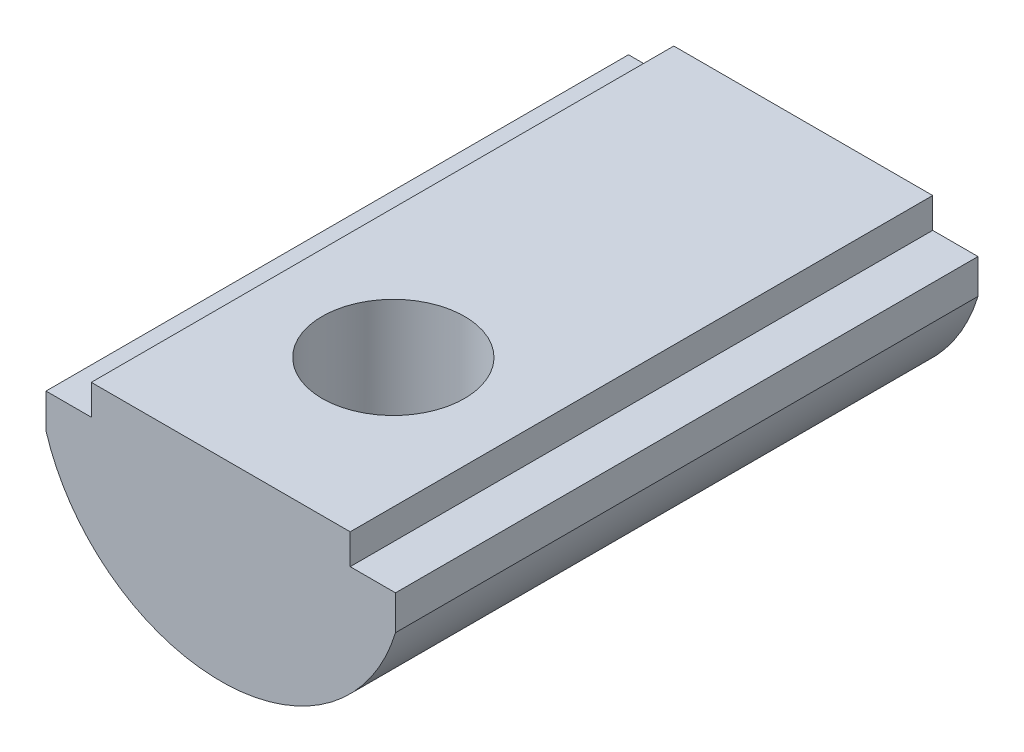
ISO-10303-21;
HEADER;
FILE_DESCRIPTION(('STEP AP214'),'2;1');
FILE_NAME('part.step','',(''),(''),'','','');
FILE_SCHEMA(('AUTOMOTIVE_DESIGN { 1 0 10303 214 1 1 1 1 }'));
ENDSEC;
DATA;
#1=APPLICATION_CONTEXT('core data for automotive mechanical design processes');
#2=APPLICATION_PROTOCOL_DEFINITION('international standard','automotive_design',2000,#1);
#3=PRODUCT_CONTEXT('',#1,'mechanical');
#4=PRODUCT('Part','Part','',(#3));
#5=PRODUCT_RELATED_PRODUCT_CATEGORY('part','',(#4));
#6=PRODUCT_DEFINITION_FORMATION('','',#4);
#7=PRODUCT_DEFINITION_CONTEXT('part definition',#1,'design');
#8=PRODUCT_DEFINITION('design','',#6,#7);
#9=PRODUCT_DEFINITION_SHAPE('','',#8);
#10=(LENGTH_UNIT() NAMED_UNIT(*) SI_UNIT(.MILLI.,.METRE.));
#11=(NAMED_UNIT(*) PLANE_ANGLE_UNIT() SI_UNIT($,.RADIAN.));
#12=(NAMED_UNIT(*) SI_UNIT($,.STERADIAN.) SOLID_ANGLE_UNIT());
#13=UNCERTAINTY_MEASURE_WITH_UNIT(LENGTH_MEASURE(1.E-05),#10,'distance_accuracy_value','');
#14=(GEOMETRIC_REPRESENTATION_CONTEXT(3) GLOBAL_UNCERTAINTY_ASSIGNED_CONTEXT((#13)) GLOBAL_UNIT_ASSIGNED_CONTEXT((#10,
#11,#12)) REPRESENTATION_CONTEXT('',''));
#15=CARTESIAN_POINT('',(0.,0.,0.));
#16=DIRECTION('',(0.,0.,1.));
#17=DIRECTION('',(1.,0.,0.));
#18=AXIS2_PLACEMENT_3D('',#15,#16,#17);
#19=CARTESIAN_POINT('',(0.,-0.26625,13.5));
#20=DIRECTION('',(0.,0.,-1.));
#21=DIRECTION('',(-1.,0.,0.));
#22=AXIS2_PLACEMENT_3D('',#19,#20,#21);
#23=CYLINDRICAL_SURFACE('',#22,4.23375);
#24=CARTESIAN_POINT('',(0.,-4.5,11.15));
#25=CARTESIAN_POINT('',(0.0891058041244661,-4.50000343855999,11.1500044723541));
#26=CARTESIAN_POINT('',(0.178182292547825,-4.49716306858424,11.1427598438274));
#27=CARTESIAN_POINT('',(0.353659647390785,-4.48611798430016,11.1141012451728));
#28=CARTESIAN_POINT('',(0.440061123374444,-4.47791450166675,11.0926905283687));
#29=CARTESIAN_POINT('',(0.607631095827552,-4.45701950575332,11.0365811156502));
#30=CARTESIAN_POINT('',(0.688809791892971,-4.44433707467174,11.0019092982417));
#31=CARTESIAN_POINT('',(0.844188331744311,-4.41573598167754,10.9204042981839));
#32=CARTESIAN_POINT('',(0.91838614860143,-4.39981638405509,10.8735675981617));
#33=CARTESIAN_POINT('',(1.06106022387717,-4.36556629739949,10.7668499486993));
#34=CARTESIAN_POINT('',(1.12917890961145,-4.34716388587932,10.7065142745199));
#35=CARTESIAN_POINT('',(1.25462414040979,-4.310361607943,10.5754767467839));
#36=CARTESIAN_POINT('',(1.31194698664906,-4.29196174454961,10.5047713551032));
#37=CARTESIAN_POINT('',(1.41653904068659,-4.25639291468844,10.3514016167389));
#38=CARTESIAN_POINT('',(1.46328755848231,-4.23930760299855,10.2683608064521));
#39=CARTESIAN_POINT('',(1.54199444317784,-4.20943117163633,10.0948266711226));
#40=CARTESIAN_POINT('',(1.57395925726925,-4.19663818074709,10.0043366150255));
#41=CARTESIAN_POINT('',(1.62075401337791,-4.17756852187403,9.82260036931336));
#42=CARTESIAN_POINT('',(1.63627012998097,-4.17103211462929,9.73155907952582));
#43=CARTESIAN_POINT('',(1.65187153604835,-4.16445965951315,9.54794832988286));
#44=CARTESIAN_POINT('',(1.65196387212644,-4.16442064319935,9.45537958720248));
#45=CARTESIAN_POINT('',(1.63723693943973,-4.17062484499483,9.27779976498704));
#46=CARTESIAN_POINT('',(1.62339351026058,-4.176456943997,9.19269065619036));
#47=CARTESIAN_POINT('',(1.58280933164281,-4.19305904456527,9.02611580984002));
#48=CARTESIAN_POINT('',(1.55606647730621,-4.20382985200408,8.94465066927209));
#49=CARTESIAN_POINT('',(1.48994335197712,-4.22932711706307,8.7857718010055));
#50=CARTESIAN_POINT('',(1.45032310579788,-4.24412774669599,8.70847037888912));
#51=CARTESIAN_POINT('',(1.35973777439539,-4.27599480926122,8.56133950041406));
#52=CARTESIAN_POINT('',(1.30876856040501,-4.29306206588071,8.49151277708362));
#53=CARTESIAN_POINT('',(1.19255246098735,-4.3290588600046,8.35594630788592));
#54=CARTESIAN_POINT('',(1.12653457302596,-4.34803336054938,8.29087774433019));
#55=CARTESIAN_POINT('',(0.984314554868977,-4.38464177218394,8.1725269076513));
#56=CARTESIAN_POINT('',(0.908110602876448,-4.40227544257655,8.11924674744325));
#57=CARTESIAN_POINT('',(0.745858278219071,-4.4346176707193,8.02516408128281));
#58=CARTESIAN_POINT('',(0.659658136243661,-4.44926823359621,7.9846019375909));
#59=CARTESIAN_POINT('',(0.480942950896423,-4.47355866289058,7.91878230158367));
#60=CARTESIAN_POINT('',(0.388430970239927,-4.48320094020609,7.89351744445904));
#61=CARTESIAN_POINT('',(0.205353789050599,-4.49595544923868,7.86033885991202));
#62=CARTESIAN_POINT('',(0.11497571566728,-4.49940699531962,7.85152238826031));
#63=CARTESIAN_POINT('',(-0.0660249391729603,-4.50045151101866,7.84884068871439));
#64=CARTESIAN_POINT('',(-0.156647455805613,-4.49804590553043,7.85497182445393));
#65=CARTESIAN_POINT('',(-0.331552747063454,-4.48786938277884,7.88133784814221));
#66=CARTESIAN_POINT('',(-0.415941701325465,-4.48032905180093,7.90096693817285));
#67=CARTESIAN_POINT('',(-0.580158270532946,-4.46087721600315,7.95295854794226));
#68=CARTESIAN_POINT('',(-0.659985293882821,-4.44896514573184,7.9853227149061));
#69=CARTESIAN_POINT('',(-0.815516176406061,-4.42148768786195,8.06291472709868));
#70=CARTESIAN_POINT('',(-0.891023075658372,-4.40582295417133,8.10850109253773));
#71=CARTESIAN_POINT('',(-1.03357632704403,-4.37255319067013,8.21084280422326));
#72=CARTESIAN_POINT('',(-1.10061937456178,-4.35494740799374,8.26760249096715));
#73=CARTESIAN_POINT('',(-1.22874653392432,-4.31835276541476,8.39485941431186));
#74=CARTESIAN_POINT('',(-1.28919342899661,-4.29934640149106,8.46599486840818));
#75=CARTESIAN_POINT('',(-1.39743577533096,-4.26313365901914,8.6177526642837));
#76=CARTESIAN_POINT('',(-1.44522956509733,-4.24592751703963,8.69837624995591));
#77=CARTESIAN_POINT('',(-1.52699805120983,-4.21528104684279,8.86779552589848));
#78=CARTESIAN_POINT('',(-1.56087034596929,-4.20186884244503,8.95664608181757));
#79=CARTESIAN_POINT('',(-1.61292646594984,-4.18082669812613,9.13946575303835));
#80=CARTESIAN_POINT('',(-1.63112107621146,-4.17319278362634,9.23343130223265));
#81=CARTESIAN_POINT('',(-1.65030209702572,-4.16512678465429,9.41684802385667));
#82=CARTESIAN_POINT('',(-1.65238630778265,-4.16423534930366,9.50616500559915));
#83=CARTESIAN_POINT('',(-1.64214096264064,-4.16856248568352,9.68380884785322));
#84=CARTESIAN_POINT('',(-1.62981301614819,-4.17378037518543,9.77213581780756));
#85=CARTESIAN_POINT('',(-1.5919729999487,-4.18934236287289,9.94208006124249));
#86=CARTESIAN_POINT('',(-1.56694626569101,-4.19949721562032,10.023824268467));
#87=CARTESIAN_POINT('',(-1.50486195403385,-4.22366501964024,10.1819925765209));
#88=CARTESIAN_POINT('',(-1.46780122756807,-4.23767898062178,10.2584152784498));
#89=CARTESIAN_POINT('',(-1.38032736392246,-4.26894951624171,10.4083736742751));
#90=CARTESIAN_POINT('',(-1.32928898682111,-4.28634258560015,10.4815157803585));
#91=CARTESIAN_POINT('',(-1.21624457370513,-4.32197410006169,10.6185458605871));
#92=CARTESIAN_POINT('',(-1.15423491465482,-4.34021282295139,10.68243076502));
#93=CARTESIAN_POINT('',(-1.01654630257848,-4.37680190011324,10.8030746007416));
#94=CARTESIAN_POINT('',(-0.940268538708849,-4.39509265964787,10.8591714844133));
#95=CARTESIAN_POINT('',(-0.778721119166017,-4.42858523046206,10.9577549534941));
#96=CARTESIAN_POINT('',(-0.693449508878511,-4.44378636817063,11.0002385722257));
#97=CARTESIAN_POINT('',(-0.509324327177186,-4.47035641176512,11.0727709335258));
#98=CARTESIAN_POINT('',(-0.409930423657547,-4.48133872581545,11.1016060556422));
#99=CARTESIAN_POINT('',(-0.207009448370095,-4.49615632940776,11.140212139955));
#100=CARTESIAN_POINT('',(-0.103484953909468,-4.49999600655395,11.1499948059348));
#101=CARTESIAN_POINT('',(0.,-4.5,11.15));
#102=B_SPLINE_CURVE_WITH_KNOTS('',3,(#24,#25,#26,#27,#28,#29,#30,#31,#32,#33,#34,#35,#36,#37,
#38,#39,#40,#41,#42,#43,#44,#45,#46,#47,#48,#49,#50,#51,#52,#53,#54,#55,#56,#57,#58,#59,#60,#61,
#62,#63,#64,#65,#66,#67,#68,#69,#70,#71,#72,#73,#74,#75,#76,#77,#78,#79,#80,#81,#82,#83,#84,#85,
#86,#87,#88,#89,#90,#91,#92,#93,#94,#95,#96,#97,#98,#99,#100,#101),.UNSPECIFIED.,.T.,.F.,(4,2,2,
2,2,2,2,2,2,2,2,2,2,2,2,2,2,2,2,2,2,2,2,2,2,2,2,2,2,2,2,2,2,2,2,2,2,2,4),(0.,0.266935428762949,
0.533809575532661,0.800145645726687,1.06655881063978,1.34385566450836,1.62124735250039,
1.91023945264743,2.19910540386678,2.47537965857762,2.75152769239923,3.0095968223042,
3.26770807757851,3.53093525507049,3.79425835182101,4.07681742358469,4.35942709936443,
4.6470943243586,4.93462294291655,5.2058455345676,5.4770021513614,5.7367215039961,
5.99647446121245,6.26406135214667,6.53175239836223,6.81622815472616,7.10074124746414,
7.38731119773042,7.67368385217437,7.94035408434556,8.20699454027942,8.4641358320913,
8.7213444671773,8.99278192818493,9.26430919359279,9.55221065479812,9.84017481447069,
10.1503766661598,10.4603879029559),.UNSPECIFIED.);
#103=CARTESIAN_POINT('',(0.,-4.5,11.15));
#104=VERTEX_POINT('',#103);
#105=EDGE_CURVE('E46',#104,#104,#102,.T.);
#106=ORIENTED_EDGE('',*,*,#105,.T.);
#107=EDGE_LOOP('',(#106));
#108=FACE_BOUND('',#107,.T.);
#109=CARTESIAN_POINT('',(0.,-0.26625,0.));
#110=DIRECTION('',(0.,0.,1.));
#111=DIRECTION('',(-1.,0.,0.));
#112=AXIS2_PLACEMENT_3D('',#109,#110,#111);
#113=CIRCLE('',#112,4.23375);
#114=CARTESIAN_POINT('',(-4.05,-1.5,0.));
#115=VERTEX_POINT('',#114);
#116=CARTESIAN_POINT('',(4.05,-1.5,0.));
#117=VERTEX_POINT('',#116);
#118=EDGE_CURVE('E135',#115,#117,#113,.T.);
#119=ORIENTED_EDGE('',*,*,#118,.T.);
#120=DIRECTION('',(0.,0.,-1.));
#121=VECTOR('',#120,1.);
#122=CARTESIAN_POINT('',(4.05,-1.5,13.5));
#123=LINE('',#122,#121);
#124=CARTESIAN_POINT('',(4.05,-1.5,13.5));
#125=VERTEX_POINT('',#124);
#126=EDGE_CURVE('E163',#125,#117,#123,.T.);
#127=ORIENTED_EDGE('',*,*,#126,.F.);
#128=CARTESIAN_POINT('',(0.,-0.26625,13.5));
#129=DIRECTION('',(0.,0.,1.));
#130=DIRECTION('',(-1.,0.,0.));
#131=AXIS2_PLACEMENT_3D('',#128,#129,#130);
#132=CIRCLE('',#131,4.23375);
#133=CARTESIAN_POINT('',(-4.05,-1.5,13.5));
#134=VERTEX_POINT('',#133);
#135=EDGE_CURVE('E150',#134,#125,#132,.T.);
#136=ORIENTED_EDGE('',*,*,#135,.F.);
#137=DIRECTION('',(0.,0.,-1.));
#138=VECTOR('',#137,1.);
#139=CARTESIAN_POINT('',(-4.05,-1.5,13.5));
#140=LINE('',#139,#138);
#141=EDGE_CURVE('E131',#134,#115,#140,.T.);
#142=ORIENTED_EDGE('',*,*,#141,.T.);
#143=EDGE_LOOP('',(#119,#127,#136,#142));
#144=FACE_BOUND('',#143,.T.);
#145=CARTESIAN_POINT('',(0.996713774045281,-4.38100402850945,3.));
#146=CARTESIAN_POINT('',(0.996712256752049,-4.38100502492075,3.05389699112058));
#147=CARTESIAN_POINT('',(0.992240519686743,-4.38209547185538,3.10781290657288));
#148=CARTESIAN_POINT('',(0.974481834245944,-4.38633552768121,3.21410973036058));
#149=CARTESIAN_POINT('',(0.961189556857812,-4.3894863813698,3.2664896907459));
#150=CARTESIAN_POINT('',(0.926203139761991,-4.39748544081629,3.36816797296027));
#151=CARTESIAN_POINT('',(0.904516926429583,-4.40233204486734,3.4174691512219));
#152=CARTESIAN_POINT('',(0.853373599866137,-4.41318534912819,3.5117095996548));
#153=CARTESIAN_POINT('',(0.823916817861096,-4.41919199988726,3.55664905563592));
#154=CARTESIAN_POINT('',(0.757609395693494,-4.43180132515102,3.64159036235709));
#155=CARTESIAN_POINT('',(0.720664668480288,-4.43841092748145,3.68151770200756));
#156=CARTESIAN_POINT('',(0.640658825691905,-4.45144239731613,3.75472162153222));
#157=CARTESIAN_POINT('',(0.597597035037312,-4.45786424400521,3.78799746637014));
#158=CARTESIAN_POINT('',(0.505576691001086,-4.469965692347,3.84770926804535));
#159=CARTESIAN_POINT('',(0.456514436333497,-4.47562715580657,3.87398920131831));
#160=CARTESIAN_POINT('',(0.354600304371904,-4.48543435418492,3.91814010895125));
#161=CARTESIAN_POINT('',(0.301748229533913,-4.4895800100236,3.93601064460452));
#162=CARTESIAN_POINT('',(0.193282939509225,-4.49593723558409,3.96302089751822));
#163=CARTESIAN_POINT('',(0.137650662341284,-4.49813269408634,3.97208794233194));
#164=CARTESIAN_POINT('',(0.0256097198781452,-4.50029326221743,3.98101287632863));
#165=CARTESIAN_POINT('',(-0.0307989475674667,-4.5002583656675,3.98087073999923));
#166=CARTESIAN_POINT('',(-0.142781205265272,-4.49796228767712,3.97138186709138));
#167=CARTESIAN_POINT('',(-0.198354932679156,-4.4957014760553,3.96203665953221));
#168=CARTESIAN_POINT('',(-0.307101536500225,-4.48919877523535,3.9343719347727));
#169=CARTESIAN_POINT('',(-0.360274373207623,-4.48495685329182,3.91605226923505));
#170=CARTESIAN_POINT('',(-0.462735896825075,-4.47495142849912,3.87087809446573));
#171=CARTESIAN_POINT('',(-0.51202288653758,-4.46918726551855,3.84401988139555));
#172=CARTESIAN_POINT('',(-0.605288867962651,-4.45677272988248,3.78243778023186));
#173=CARTESIAN_POINT('',(-0.649267799627562,-4.45012234720336,3.74771380316929));
#174=CARTESIAN_POINT('',(-0.730561926214944,-4.43669546874781,3.67137234078111));
#175=CARTESIAN_POINT('',(-0.767891852684348,-4.42991928944726,3.62977049888311));
#176=CARTESIAN_POINT('',(-0.834911913119816,-4.41700049434661,3.54072115393589));
#177=CARTESIAN_POINT('',(-0.86460264719404,-4.41085782880261,3.49327411049848));
#178=CARTESIAN_POINT('',(-0.915065646867823,-4.40000777457676,3.39459814674525));
#179=CARTESIAN_POINT('',(-0.935963826332135,-4.39528042318698,3.34343586470598));
#180=CARTESIAN_POINT('',(-0.968828605839573,-4.38769362666553,3.2381879764742));
#181=CARTESIAN_POINT('',(-0.980796557178201,-4.3848338989388,3.18410281389206));
#182=CARTESIAN_POINT('',(-0.995258702501088,-4.38136283282423,3.07586991088252));
#183=CARTESIAN_POINT('',(-0.997962798304883,-4.38070168891998,3.02175174730674));
#184=CARTESIAN_POINT('',(-0.994402751292175,-4.38156354315097,2.91383150408809));
#185=CARTESIAN_POINT('',(-0.988139273396978,-4.38308637935001,2.86002940130716));
#186=CARTESIAN_POINT('',(-0.96694673595045,-4.38811467128409,2.75483530808954));
#187=CARTESIAN_POINT('',(-0.952106845974153,-4.39159971632518,2.70342431283568));
#188=CARTESIAN_POINT('',(-0.914267088965298,-4.40014992207137,2.60384167344066));
#189=CARTESIAN_POINT('',(-0.891266798955244,-4.40521516468112,2.55567019736727));
#190=CARTESIAN_POINT('',(-0.837418622526385,-4.41644661468188,2.46325222152052));
#191=CARTESIAN_POINT('',(-0.806475346499283,-4.42262591168737,2.41906293831705));
#192=CARTESIAN_POINT('',(-0.737752747305828,-4.43537202211561,2.33643046835112));
#193=CARTESIAN_POINT('',(-0.699972641862162,-4.44193887982547,2.2979879400586));
#194=CARTESIAN_POINT('',(-0.617677893768889,-4.45491130522523,2.22699392403255));
#195=CARTESIAN_POINT('',(-0.573030490559106,-4.46130988673398,2.19459499115833));
#196=CARTESIAN_POINT('',(-0.478892995968475,-4.47309544652259,2.1375830602711));
#197=CARTESIAN_POINT('',(-0.429402530407572,-4.47848234654487,2.11297066447689));
#198=CARTESIAN_POINT('',(-0.326229904061679,-4.48773428954018,2.07184186061798));
#199=CARTESIAN_POINT('',(-0.27249935492223,-4.49157732396257,2.05544176478266));
#200=CARTESIAN_POINT('',(-0.162975177332948,-4.49721726538817,2.03165449967298));
#201=CARTESIAN_POINT('',(-0.107181515690195,-4.49901413945638,2.02426747547281));
#202=CARTESIAN_POINT('',(0.00499916490925216,-4.50036929110753,2.01868074858725));
#203=CARTESIAN_POINT('',(0.0613871182392231,-4.49992325919172,2.02049873236513));
#204=CARTESIAN_POINT('',(0.173047667862059,-4.4968307883377,2.03331870689214));
#205=CARTESIAN_POINT('',(0.228320255785168,-4.49418433289371,2.0443207665328));
#206=CARTESIAN_POINT('',(0.336166798451702,-4.48697891136392,2.07523541695417));
#207=CARTESIAN_POINT('',(0.388741501965219,-4.48242047918501,2.09514552032586));
#208=CARTESIAN_POINT('',(0.489721409765448,-4.47188806551393,2.14338680504448));
#209=CARTESIAN_POINT('',(0.538126594538948,-4.4659140773975,2.17171802579919));
#210=CARTESIAN_POINT('',(0.629395307181066,-4.45320913217786,2.23609700186397));
#211=CARTESIAN_POINT('',(0.672258507806282,-4.44647813041831,2.27214521251383));
#212=CARTESIAN_POINT('',(0.751209049091737,-4.43301512259578,2.35103830154088));
#213=CARTESIAN_POINT('',(0.787295771470537,-4.42628311649719,2.3938837994408));
#214=CARTESIAN_POINT('',(0.851336512037371,-4.4136497307053,2.48481486162436));
#215=CARTESIAN_POINT('',(0.879358836487203,-4.40774160719413,2.5328513684301));
#216=CARTESIAN_POINT('',(0.92682617132969,-4.39737901508484,2.63310951151991));
#217=CARTESIAN_POINT('',(0.946277858050916,-4.39292341571034,2.68532785264381));
#218=CARTESIAN_POINT('',(0.972926296118792,-4.38671081483529,2.78126871655182));
#219=CARTESIAN_POINT('',(0.981829686152931,-4.38458544055248,2.82450182814068));
#220=CARTESIAN_POINT('',(0.993723897969256,-4.38173167470606,2.91181909896143));
#221=CARTESIAN_POINT('',(0.996715015445798,-4.38100321327778,2.95590321552009));
#222=CARTESIAN_POINT('',(0.996713774045281,-4.38100402850945,3.));
#223=B_SPLINE_CURVE_WITH_KNOTS('',3,(#145,#146,#147,#148,#149,#150,#151,#152,#153,#154,#155,
#156,#157,#158,#159,#160,#161,#162,#163,#164,#165,#166,#167,#168,#169,#170,#171,#172,#173,#174,
#175,#176,#177,#178,#179,#180,#181,#182,#183,#184,#185,#186,#187,#188,#189,#190,#191,#192,#193,
#194,#195,#196,#197,#198,#199,#200,#201,#202,#203,#204,#205,#206,#207,#208,#209,#210,#211,#212,
#213,#214,#215,#216,#217,#218,#219,#220,#221,#222),.UNSPECIFIED.,.T.,.F.,(4,2,2,2,2,2,2,2,2,2,2,
2,2,2,2,2,2,2,2,2,2,2,2,2,2,2,2,2,2,2,2,2,2,2,2,2,2,2,4),(0.,0.161529886648151,
0.323157452059853,0.484632763808414,0.64610119366925,0.809740602572905,0.973398084780012,
1.14044685173976,1.30750433243786,1.47592942809807,1.64435499034933,1.81275257471318,
1.98115294258643,2.14962645882287,2.31810188074526,2.48619925478504,2.65428341965013,
2.81987107280707,2.98543366464995,3.14721917491318,3.30899268984014,3.46911374188114,
3.62924309467922,3.7913936339915,3.95356273848602,4.1193922391383,4.28523456208162,
4.45336362696847,4.62149539802128,4.78995033919144,4.95840654398592,5.12681573978072,
5.29522572368221,5.46364564732913,5.63208093004131,5.79904446994931,5.96587771818353,
6.098042885886,6.23020144335819),.UNSPECIFIED.);
#224=CARTESIAN_POINT('',(0.996713774045281,-4.38100402850945,3.));
#225=VERTEX_POINT('',#224);
#226=EDGE_CURVE('E11',#225,#225,#223,.T.);
#227=ORIENTED_EDGE('',*,*,#226,.F.);
#228=EDGE_LOOP('',(#227));
#229=FACE_BOUND('',#228,.T.);
#230=ADVANCED_FACE('F33',(#108,#144,#229),#23,.T.);
#231=CARTESIAN_POINT('',(4.05,-0.699999999999999,13.5));
#232=DIRECTION('',(-1.,0.,0.));
#233=DIRECTION('',(0.,0.,1.));
#234=AXIS2_PLACEMENT_3D('',#231,#232,#233);
#235=PLANE('',#234);
#236=DIRECTION('',(0.,1.,0.));
#237=VECTOR('',#236,1.);
#238=CARTESIAN_POINT('',(4.05,-0.699999999999999,0.));
#239=LINE('',#238,#237);
#240=CARTESIAN_POINT('',(4.05,-0.699999999999999,0.));
#241=VERTEX_POINT('',#240);
#242=EDGE_CURVE('E138',#117,#241,#239,.T.);
#243=ORIENTED_EDGE('',*,*,#242,.T.);
#244=DIRECTION('',(0.,0.,-1.));
#245=VECTOR('',#244,1.);
#246=CARTESIAN_POINT('',(4.05,-0.699999999999999,13.5));
#247=LINE('',#246,#245);
#248=CARTESIAN_POINT('',(4.05,-0.699999999999999,13.5));
#249=VERTEX_POINT('',#248);
#250=EDGE_CURVE('E160',#249,#241,#247,.T.);
#251=ORIENTED_EDGE('',*,*,#250,.F.);
#252=DIRECTION('',(0.,1.,0.));
#253=VECTOR('',#252,1.);
#254=CARTESIAN_POINT('',(4.05,-0.699999999999999,13.5));
#255=LINE('',#254,#253);
#256=EDGE_CURVE('E98',#125,#249,#255,.T.);
#257=ORIENTED_EDGE('',*,*,#256,.F.);
#258=ORIENTED_EDGE('',*,*,#126,.T.);
#259=EDGE_LOOP('',(#243,#251,#257,#258));
#260=FACE_BOUND('',#259,.T.);
#261=ADVANCED_FACE('F199',(#260),#235,.F.);
#262=CARTESIAN_POINT('',(3.,-0.699999999999999,13.5));
#263=DIRECTION('',(0.,-1.,0.));
#264=DIRECTION('',(0.,0.,-1.));
#265=AXIS2_PLACEMENT_3D('',#262,#263,#264);
#266=PLANE('',#265);
#267=DIRECTION('',(-1.,0.,0.));
#268=VECTOR('',#267,1.);
#269=CARTESIAN_POINT('',(3.,-0.699999999999999,0.));
#270=LINE('',#269,#268);
#271=CARTESIAN_POINT('',(3.,-0.699999999999999,0.));
#272=VERTEX_POINT('',#271);
#273=EDGE_CURVE('E141',#241,#272,#270,.T.);
#274=ORIENTED_EDGE('',*,*,#273,.T.);
#275=DIRECTION('',(0.,0.,-1.));
#276=VECTOR('',#275,1.);
#277=CARTESIAN_POINT('',(3.,-0.699999999999999,13.5));
#278=LINE('',#277,#276);
#279=CARTESIAN_POINT('',(3.,-0.699999999999999,13.5));
#280=VERTEX_POINT('',#279);
#281=EDGE_CURVE('E157',#280,#272,#278,.T.);
#282=ORIENTED_EDGE('',*,*,#281,.F.);
#283=DIRECTION('',(-1.,0.,0.));
#284=VECTOR('',#283,1.);
#285=CARTESIAN_POINT('',(3.,-0.699999999999999,13.5));
#286=LINE('',#285,#284);
#287=EDGE_CURVE('E211',#249,#280,#286,.T.);
#288=ORIENTED_EDGE('',*,*,#287,.F.);
#289=ORIENTED_EDGE('',*,*,#250,.T.);
#290=EDGE_LOOP('',(#274,#282,#288,#289));
#291=FACE_BOUND('',#290,.T.);
#292=ADVANCED_FACE('F196',(#291),#266,.F.);
#293=CARTESIAN_POINT('',(3.,0.,13.5));
#294=DIRECTION('',(-1.,0.,0.));
#295=DIRECTION('',(0.,-1.,0.));
#296=AXIS2_PLACEMENT_3D('',#293,#294,#295);
#297=PLANE('',#296);
#298=DIRECTION('',(0.,1.,0.));
#299=VECTOR('',#298,1.);
#300=CARTESIAN_POINT('',(3.,0.,0.));
#301=LINE('',#300,#299);
#302=CARTESIAN_POINT('',(3.,0.,0.));
#303=VERTEX_POINT('',#302);
#304=EDGE_CURVE('E143',#272,#303,#301,.T.);
#305=ORIENTED_EDGE('',*,*,#304,.T.);
#306=DIRECTION('',(0.,0.,-1.));
#307=VECTOR('',#306,1.);
#308=CARTESIAN_POINT('',(3.,0.,13.5));
#309=LINE('',#308,#307);
#310=CARTESIAN_POINT('',(3.,0.,13.5));
#311=VERTEX_POINT('',#310);
#312=EDGE_CURVE('E154',#311,#303,#309,.T.);
#313=ORIENTED_EDGE('',*,*,#312,.F.);
#314=DIRECTION('',(0.,1.,0.));
#315=VECTOR('',#314,1.);
#316=CARTESIAN_POINT('',(3.,0.,13.5));
#317=LINE('',#316,#315);
#318=EDGE_CURVE('E217',#280,#311,#317,.T.);
#319=ORIENTED_EDGE('',*,*,#318,.F.);
#320=ORIENTED_EDGE('',*,*,#281,.T.);
#321=EDGE_LOOP('',(#305,#313,#319,#320));
#322=FACE_BOUND('',#321,.T.);
#323=ADVANCED_FACE('F192',(#322),#297,.F.);
#324=CARTESIAN_POINT('',(-3.,0.,13.5));
#325=DIRECTION('',(0.,-1.,0.));
#326=DIRECTION('',(1.,0.,0.));
#327=AXIS2_PLACEMENT_3D('',#324,#325,#326);
#328=PLANE('',#327);
#329=CARTESIAN_POINT('',(0.,0.,9.5));
#330=DIRECTION('',(0.,1.,0.));
#331=DIRECTION('',(0.,0.,1.));
#332=AXIS2_PLACEMENT_3D('',#329,#330,#331);
#333=CIRCLE('',#332,1.65);
#334=CARTESIAN_POINT('',(0.,0.,11.15));
#335=VERTEX_POINT('',#334);
#336=EDGE_CURVE('E139',#335,#335,#333,.T.);
#337=ORIENTED_EDGE('',*,*,#336,.F.);
#338=EDGE_LOOP('',(#337));
#339=FACE_BOUND('',#338,.T.);
#340=DIRECTION('',(-1.,0.,0.));
#341=VECTOR('',#340,1.);
#342=CARTESIAN_POINT('',(-3.,0.,0.));
#343=LINE('',#342,#341);
#344=CARTESIAN_POINT('',(-3.,0.,0.));
#345=VERTEX_POINT('',#344);
#346=EDGE_CURVE('E145',#303,#345,#343,.T.);
#347=ORIENTED_EDGE('',*,*,#346,.T.);
#348=DIRECTION('',(0.,0.,-1.));
#349=VECTOR('',#348,1.);
#350=CARTESIAN_POINT('',(-3.,0.,13.5));
#351=LINE('',#350,#349);
#352=CARTESIAN_POINT('',(-3.,0.,13.5));
#353=VERTEX_POINT('',#352);
#354=EDGE_CURVE('E126',#353,#345,#351,.T.);
#355=ORIENTED_EDGE('',*,*,#354,.F.);
#356=DIRECTION('',(-1.,0.,0.));
#357=VECTOR('',#356,1.);
#358=CARTESIAN_POINT('',(-3.,0.,13.5));
#359=LINE('',#358,#357);
#360=EDGE_CURVE('E117',#311,#353,#359,.T.);
#361=ORIENTED_EDGE('',*,*,#360,.F.);
#362=ORIENTED_EDGE('',*,*,#312,.T.);
#363=EDGE_LOOP('',(#347,#355,#361,#362));
#364=FACE_BOUND('',#363,.T.);
#365=ADVANCED_FACE('F189',(#339,#364),#328,.F.);
#366=CARTESIAN_POINT('',(-3.,0.,13.5));
#367=DIRECTION('',(1.,0.,0.));
#368=DIRECTION('',(0.,1.,0.));
#369=AXIS2_PLACEMENT_3D('',#366,#367,#368);
#370=PLANE('',#369);
#371=DIRECTION('',(0.,-1.,0.));
#372=VECTOR('',#371,1.);
#373=CARTESIAN_POINT('',(-3.,0.,0.));
#374=LINE('',#373,#372);
#375=CARTESIAN_POINT('',(-3.,-0.7,0.));
#376=VERTEX_POINT('',#375);
#377=EDGE_CURVE('E125',#345,#376,#374,.T.);
#378=ORIENTED_EDGE('',*,*,#377,.T.);
#379=DIRECTION('',(0.,0.,-1.));
#380=VECTOR('',#379,1.);
#381=CARTESIAN_POINT('',(-3.,-0.7,13.5));
#382=LINE('',#381,#380);
#383=CARTESIAN_POINT('',(-3.,-0.7,13.5));
#384=VERTEX_POINT('',#383);
#385=EDGE_CURVE('E122',#384,#376,#382,.T.);
#386=ORIENTED_EDGE('',*,*,#385,.F.);
#387=DIRECTION('',(0.,-1.,0.));
#388=VECTOR('',#387,1.);
#389=CARTESIAN_POINT('',(-3.,0.,13.5));
#390=LINE('',#389,#388);
#391=EDGE_CURVE('E111',#353,#384,#390,.T.);
#392=ORIENTED_EDGE('',*,*,#391,.F.);
#393=ORIENTED_EDGE('',*,*,#354,.T.);
#394=EDGE_LOOP('',(#378,#386,#392,#393));
#395=FACE_BOUND('',#394,.T.);
#396=ADVANCED_FACE('F123',(#395),#370,.F.);
#397=CARTESIAN_POINT('',(-3.,-0.7,13.5));
#398=DIRECTION('',(0.,-1.,0.));
#399=DIRECTION('',(1.,0.,0.));
#400=AXIS2_PLACEMENT_3D('',#397,#398,#399);
#401=PLANE('',#400);
#402=DIRECTION('',(-1.,0.,0.));
#403=VECTOR('',#402,1.);
#404=CARTESIAN_POINT('',(-3.,-0.7,0.));
#405=LINE('',#404,#403);
#406=CARTESIAN_POINT('',(-4.05,-0.7,0.));
#407=VERTEX_POINT('',#406);
#408=EDGE_CURVE('E83',#376,#407,#405,.T.);
#409=ORIENTED_EDGE('',*,*,#408,.T.);
#410=DIRECTION('',(0.,0.,-1.));
#411=VECTOR('',#410,1.);
#412=CARTESIAN_POINT('',(-4.05,-0.7,13.5));
#413=LINE('',#412,#411);
#414=CARTESIAN_POINT('',(-4.05,-0.7,13.5));
#415=VERTEX_POINT('',#414);
#416=EDGE_CURVE('E127',#415,#407,#413,.T.);
#417=ORIENTED_EDGE('',*,*,#416,.F.);
#418=DIRECTION('',(-1.,0.,0.));
#419=VECTOR('',#418,1.);
#420=CARTESIAN_POINT('',(-3.,-0.7,13.5));
#421=LINE('',#420,#419);
#422=EDGE_CURVE('E115',#384,#415,#421,.T.);
#423=ORIENTED_EDGE('',*,*,#422,.F.);
#424=ORIENTED_EDGE('',*,*,#385,.T.);
#425=EDGE_LOOP('',(#409,#417,#423,#424));
#426=FACE_BOUND('',#425,.T.);
#427=ADVANCED_FACE('F129',(#426),#401,.F.);
#428=CARTESIAN_POINT('',(-4.05,-0.7,13.5));
#429=DIRECTION('',(1.,0.,0.));
#430=DIRECTION('',(0.,0.,-1.));
#431=AXIS2_PLACEMENT_3D('',#428,#429,#430);
#432=PLANE('',#431);
#433=DIRECTION('',(0.,-1.,0.));
#434=VECTOR('',#433,1.);
#435=CARTESIAN_POINT('',(-4.05,-0.7,0.));
#436=LINE('',#435,#434);
#437=EDGE_CURVE('E89',#407,#115,#436,.T.);
#438=ORIENTED_EDGE('',*,*,#437,.T.);
#439=ORIENTED_EDGE('',*,*,#141,.F.);
#440=DIRECTION('',(0.,-1.,0.));
#441=VECTOR('',#440,1.);
#442=CARTESIAN_POINT('',(-4.05,-0.7,13.5));
#443=LINE('',#442,#441);
#444=EDGE_CURVE('E54',#415,#134,#443,.T.);
#445=ORIENTED_EDGE('',*,*,#444,.F.);
#446=ORIENTED_EDGE('',*,*,#416,.T.);
#447=EDGE_LOOP('',(#438,#439,#445,#446));
#448=FACE_BOUND('',#447,.T.);
#449=ADVANCED_FACE('F179',(#448),#432,.F.);
#450=CARTESIAN_POINT('',(0.,-0.26625,13.5));
#451=DIRECTION('',(0.,0.,-1.));
#452=DIRECTION('',(-1.,0.,0.));
#453=AXIS2_PLACEMENT_3D('',#450,#451,#452);
#454=PLANE('',#453);
#455=ORIENTED_EDGE('',*,*,#135,.T.);
#456=ORIENTED_EDGE('',*,*,#256,.T.);
#457=ORIENTED_EDGE('',*,*,#287,.T.);
#458=ORIENTED_EDGE('',*,*,#318,.T.);
#459=ORIENTED_EDGE('',*,*,#360,.T.);
#460=ORIENTED_EDGE('',*,*,#391,.T.);
#461=ORIENTED_EDGE('',*,*,#422,.T.);
#462=ORIENTED_EDGE('',*,*,#444,.T.);
#463=EDGE_LOOP('',(#455,#456,#457,#458,#459,#460,#461,#462));
#464=FACE_BOUND('',#463,.T.);
#465=ADVANCED_FACE('F113',(#464),#454,.F.);
#466=CARTESIAN_POINT('',(0.,-0.26625,0.));
#467=DIRECTION('',(0.,0.,-1.));
#468=DIRECTION('',(-1.,0.,0.));
#469=AXIS2_PLACEMENT_3D('',#466,#467,#468);
#470=PLANE('',#469);
#471=ORIENTED_EDGE('',*,*,#118,.F.);
#472=ORIENTED_EDGE('',*,*,#437,.F.);
#473=ORIENTED_EDGE('',*,*,#408,.F.);
#474=ORIENTED_EDGE('',*,*,#377,.F.);
#475=ORIENTED_EDGE('',*,*,#346,.F.);
#476=ORIENTED_EDGE('',*,*,#304,.F.);
#477=ORIENTED_EDGE('',*,*,#273,.F.);
#478=ORIENTED_EDGE('',*,*,#242,.F.);
#479=EDGE_LOOP('',(#471,#472,#473,#474,#475,#476,#477,#478));
#480=FACE_BOUND('',#479,.T.);
#481=ADVANCED_FACE('F174',(#480),#470,.T.);
#482=CARTESIAN_POINT('',(0.,0.,9.5));
#483=DIRECTION('',(0.,1.,0.));
#484=DIRECTION('',(0.,0.,1.));
#485=AXIS2_PLACEMENT_3D('',#482,#483,#484);
#486=CYLINDRICAL_SURFACE('',#485,1.65);
#487=ORIENTED_EDGE('',*,*,#336,.T.);
#488=EDGE_LOOP('',(#487));
#489=FACE_BOUND('',#488,.T.);
#490=ORIENTED_EDGE('',*,*,#105,.F.);
#491=EDGE_LOOP('',(#490));
#492=FACE_BOUND('',#491,.T.);
#493=ADVANCED_FACE('F169',(#489,#492),#486,.F.);
#494=CARTESIAN_POINT('',(0.,-4.3,3.));
#495=DIRECTION('',(0.,1.,0.));
#496=DIRECTION('',(0.,0.,-1.));
#497=AXIS2_PLACEMENT_3D('',#494,#495,#496);
#498=SPHERICAL_SURFACE('',#497,1.);
#499=ORIENTED_EDGE('',*,*,#226,.T.);
#500=EDGE_LOOP('',(#499));
#501=FACE_BOUND('',#500,.T.);
#502=ADVANCED_FACE('F173',(#501),#498,.T.);
#503=CLOSED_SHELL('',(#230,#261,#292,#323,#365,#396,#427,#449,#465,#481,#493,#502));
#504=MANIFOLD_SOLID_BREP('B2',#503);
#505=ADVANCED_BREP_SHAPE_REPRESENTATION('',(#18,#504),#14);
#506=SHAPE_DEFINITION_REPRESENTATION(#9,#505);
ENDSEC;
END-ISO-10303-21;
